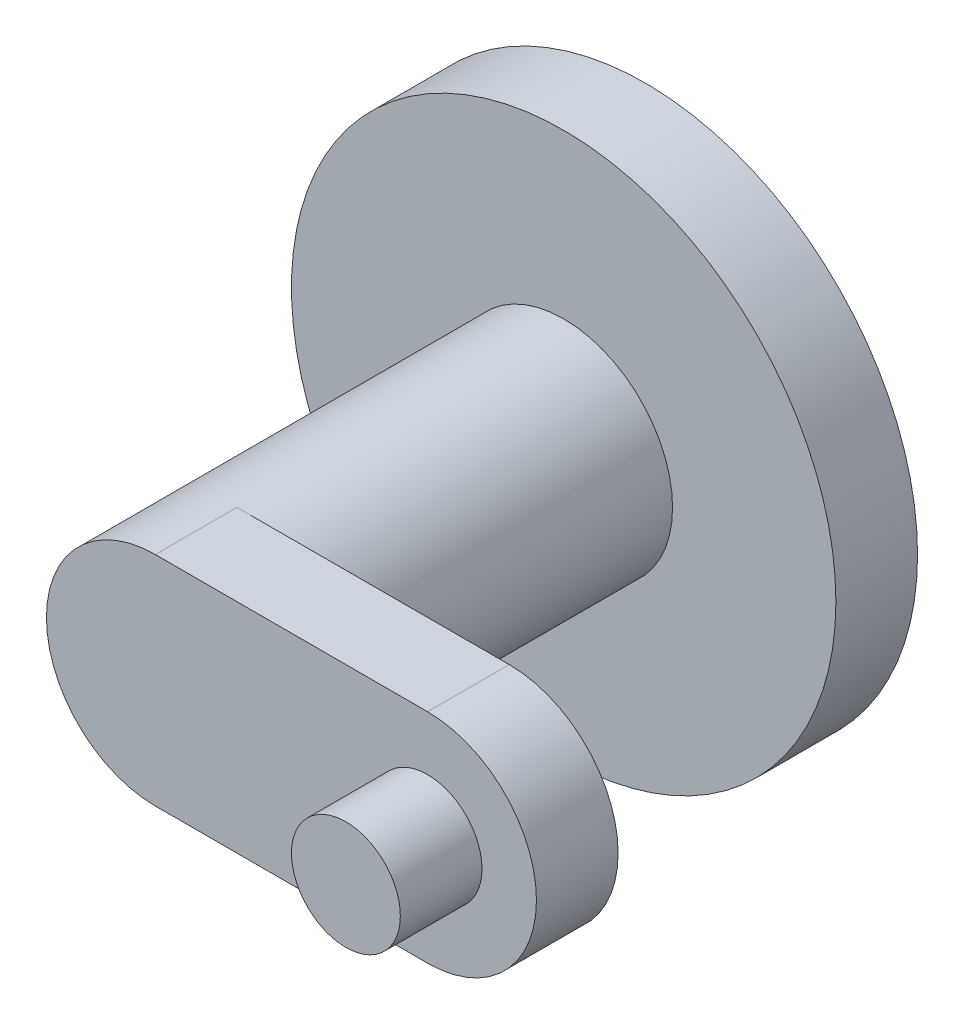
ISO-10303-21;
HEADER;
FILE_DESCRIPTION(('STEP AP214'),'2;1');
FILE_NAME('part.step','',(''),(''),'','','');
FILE_SCHEMA(('AUTOMOTIVE_DESIGN { 1 0 10303 214 1 1 1 1 }'));
ENDSEC;
DATA;
#1=APPLICATION_CONTEXT('core data for automotive mechanical design processes');
#2=APPLICATION_PROTOCOL_DEFINITION('international standard','automotive_design',2000,#1);
#3=PRODUCT_CONTEXT('',#1,'mechanical');
#4=PRODUCT('Part','Part','',(#3));
#5=PRODUCT_RELATED_PRODUCT_CATEGORY('part','',(#4));
#6=PRODUCT_DEFINITION_FORMATION('','',#4);
#7=PRODUCT_DEFINITION_CONTEXT('part definition',#1,'design');
#8=PRODUCT_DEFINITION('design','',#6,#7);
#9=PRODUCT_DEFINITION_SHAPE('','',#8);
#10=(LENGTH_UNIT() NAMED_UNIT(*) SI_UNIT(.MILLI.,.METRE.));
#11=(NAMED_UNIT(*) PLANE_ANGLE_UNIT() SI_UNIT($,.RADIAN.));
#12=(NAMED_UNIT(*) SI_UNIT($,.STERADIAN.) SOLID_ANGLE_UNIT());
#13=UNCERTAINTY_MEASURE_WITH_UNIT(LENGTH_MEASURE(1.E-05),#10,'distance_accuracy_value','');
#14=(GEOMETRIC_REPRESENTATION_CONTEXT(3) GLOBAL_UNCERTAINTY_ASSIGNED_CONTEXT((#13)) GLOBAL_UNIT_ASSIGNED_CONTEXT((#10,
#11,#12)) REPRESENTATION_CONTEXT('',''));
#15=CARTESIAN_POINT('',(0.,0.,0.));
#16=DIRECTION('',(0.,0.,1.));
#17=DIRECTION('',(1.,0.,0.));
#18=AXIS2_PLACEMENT_3D('',#15,#16,#17);
#19=CARTESIAN_POINT('',(0.,0.,30.));
#20=DIRECTION('',(0.,0.,-1.));
#21=DIRECTION('',(-1.,0.,0.));
#22=AXIS2_PLACEMENT_3D('',#19,#20,#21);
#23=CYLINDRICAL_SURFACE('',#22,100.);
#24=CARTESIAN_POINT('',(0.,0.,30.));
#25=DIRECTION('',(0.,0.,1.));
#26=DIRECTION('',(1.,0.,0.));
#27=AXIS2_PLACEMENT_3D('',#24,#25,#26);
#28=CIRCLE('',#27,100.);
#29=CARTESIAN_POINT('',(100.,0.,30.));
#30=VERTEX_POINT('',#29);
#31=EDGE_CURVE('E72',#30,#30,#28,.T.);
#32=ORIENTED_EDGE('',*,*,#31,.F.);
#33=EDGE_LOOP('',(#32));
#34=FACE_BOUND('',#33,.T.);
#35=CARTESIAN_POINT('',(0.,0.,0.));
#36=DIRECTION('',(0.,0.,1.));
#37=DIRECTION('',(1.,0.,0.));
#38=AXIS2_PLACEMENT_3D('',#35,#36,#37);
#39=CIRCLE('',#38,100.);
#40=CARTESIAN_POINT('',(100.,0.,0.));
#41=VERTEX_POINT('',#40);
#42=EDGE_CURVE('E67',#41,#41,#39,.T.);
#43=ORIENTED_EDGE('',*,*,#42,.T.);
#44=EDGE_LOOP('',(#43));
#45=FACE_BOUND('',#44,.T.);
#46=ADVANCED_FACE('F64',(#34,#45),#23,.T.);
#47=CARTESIAN_POINT('',(0.,0.,30.));
#48=DIRECTION('',(0.,0.,1.));
#49=DIRECTION('',(1.,0.,0.));
#50=AXIS2_PLACEMENT_3D('',#47,#48,#49);
#51=PLANE('',#50);
#52=CARTESIAN_POINT('',(0.,0.,30.));
#53=DIRECTION('',(0.,0.,1.));
#54=DIRECTION('',(1.,0.,0.));
#55=AXIS2_PLACEMENT_3D('',#52,#53,#54);
#56=CIRCLE('',#55,40.);
#57=CARTESIAN_POINT('',(40.,0.,30.));
#58=VERTEX_POINT('',#57);
#59=EDGE_CURVE('E12',#58,#58,#56,.T.);
#60=ORIENTED_EDGE('',*,*,#59,.F.);
#61=EDGE_LOOP('',(#60));
#62=FACE_BOUND('',#61,.T.);
#63=ORIENTED_EDGE('',*,*,#31,.T.);
#64=EDGE_LOOP('',(#63));
#65=FACE_BOUND('',#64,.T.);
#66=ADVANCED_FACE('F150',(#62,#65),#51,.T.);
#67=CARTESIAN_POINT('',(0.,0.,0.));
#68=DIRECTION('',(0.,0.,1.));
#69=DIRECTION('',(1.,0.,0.));
#70=AXIS2_PLACEMENT_3D('',#67,#68,#69);
#71=PLANE('',#70);
#72=ORIENTED_EDGE('',*,*,#42,.F.);
#73=EDGE_LOOP('',(#72));
#74=FACE_BOUND('',#73,.T.);
#75=ADVANCED_FACE('F147',(#74),#71,.F.);
#76=CARTESIAN_POINT('',(0.,0.,180.));
#77=DIRECTION('',(0.,0.,-1.));
#78=DIRECTION('',(-1.,0.,0.));
#79=AXIS2_PLACEMENT_3D('',#76,#77,#78);
#80=CYLINDRICAL_SURFACE('',#79,40.);
#81=CARTESIAN_POINT('',(0.,0.,180.));
#82=DIRECTION('',(0.,0.,1.));
#83=DIRECTION('',(1.,0.,0.));
#84=AXIS2_PLACEMENT_3D('',#81,#82,#83);
#85=CIRCLE('',#84,40.);
#86=CARTESIAN_POINT('',(0.,40.,180.));
#87=VERTEX_POINT('',#86);
#88=CARTESIAN_POINT('',(0.,-40.,180.));
#89=VERTEX_POINT('',#88);
#90=EDGE_CURVE('E80',#87,#89,#85,.T.);
#91=ORIENTED_EDGE('',*,*,#90,.F.);
#92=DIRECTION('',(0.,0.,1.));
#93=VECTOR('',#92,1.);
#94=CARTESIAN_POINT('',(0.,40.,150.));
#95=LINE('',#94,#93);
#96=CARTESIAN_POINT('',(0.,40.,150.));
#97=VERTEX_POINT('',#96);
#98=EDGE_CURVE('E130',#97,#87,#95,.T.);
#99=ORIENTED_EDGE('',*,*,#98,.F.);
#100=CARTESIAN_POINT('',(0.,0.,150.));
#101=DIRECTION('',(0.,0.,1.));
#102=DIRECTION('',(1.,0.,0.));
#103=AXIS2_PLACEMENT_3D('',#100,#101,#102);
#104=CIRCLE('',#103,40.);
#105=CARTESIAN_POINT('',(0.,-40.,150.));
#106=VERTEX_POINT('',#105);
#107=EDGE_CURVE('E85',#106,#97,#104,.T.);
#108=ORIENTED_EDGE('',*,*,#107,.F.);
#109=DIRECTION('',(0.,0.,1.));
#110=VECTOR('',#109,1.);
#111=CARTESIAN_POINT('',(0.,-40.,150.));
#112=LINE('',#111,#110);
#113=EDGE_CURVE('E135',#106,#89,#112,.T.);
#114=ORIENTED_EDGE('',*,*,#113,.T.);
#115=EDGE_LOOP('',(#91,#99,#108,#114));
#116=FACE_BOUND('',#115,.T.);
#117=ORIENTED_EDGE('',*,*,#59,.T.);
#118=EDGE_LOOP('',(#117));
#119=FACE_BOUND('',#118,.T.);
#120=ADVANCED_FACE('F149',(#116,#119),#80,.T.);
#121=CARTESIAN_POINT('',(0.,0.,180.));
#122=DIRECTION('',(0.,0.,1.));
#123=DIRECTION('',(1.,0.,0.));
#124=AXIS2_PLACEMENT_3D('',#121,#122,#123);
#125=PLANE('',#124);
#126=CARTESIAN_POINT('',(100.,0.,180.));
#127=DIRECTION('',(0.,0.,1.));
#128=DIRECTION('',(1.,0.,0.));
#129=AXIS2_PLACEMENT_3D('',#126,#127,#128);
#130=CIRCLE('',#129,20.);
#131=CARTESIAN_POINT('',(120.,0.,180.));
#132=VERTEX_POINT('',#131);
#133=EDGE_CURVE('E253',#132,#132,#130,.T.);
#134=ORIENTED_EDGE('',*,*,#133,.F.);
#135=EDGE_LOOP('',(#134));
#136=FACE_BOUND('',#135,.T.);
#137=ORIENTED_EDGE('',*,*,#90,.T.);
#138=DIRECTION('',(1.,0.,0.));
#139=VECTOR('',#138,1.);
#140=CARTESIAN_POINT('',(0.,-40.,180.));
#141=LINE('',#140,#139);
#142=CARTESIAN_POINT('',(100.,-40.,180.));
#143=VERTEX_POINT('',#142);
#144=EDGE_CURVE('E118',#89,#143,#141,.T.);
#145=ORIENTED_EDGE('',*,*,#144,.T.);
#146=CARTESIAN_POINT('',(100.,0.,180.));
#147=DIRECTION('',(0.,0.,1.));
#148=DIRECTION('',(1.,0.,0.));
#149=AXIS2_PLACEMENT_3D('',#146,#147,#148);
#150=CIRCLE('',#149,40.);
#151=CARTESIAN_POINT('',(100.,40.,180.));
#152=VERTEX_POINT('',#151);
#153=EDGE_CURVE('E105',#143,#152,#150,.T.);
#154=ORIENTED_EDGE('',*,*,#153,.T.);
#155=DIRECTION('',(1.,0.,0.));
#156=VECTOR('',#155,1.);
#157=CARTESIAN_POINT('',(0.,40.,180.));
#158=LINE('',#157,#156);
#159=EDGE_CURVE('E117',#87,#152,#158,.T.);
#160=ORIENTED_EDGE('',*,*,#159,.F.);
#161=EDGE_LOOP('',(#137,#145,#154,#160));
#162=FACE_BOUND('',#161,.T.);
#163=ADVANCED_FACE('F121',(#136,#162),#125,.T.);
#164=CARTESIAN_POINT('',(0.,0.,150.));
#165=DIRECTION('',(0.,0.,1.));
#166=DIRECTION('',(1.,0.,0.));
#167=AXIS2_PLACEMENT_3D('',#164,#165,#166);
#168=PLANE('',#167);
#169=DIRECTION('',(1.,0.,0.));
#170=VECTOR('',#169,1.);
#171=CARTESIAN_POINT('',(0.,-40.,150.));
#172=LINE('',#171,#170);
#173=CARTESIAN_POINT('',(100.,-40.,150.));
#174=VERTEX_POINT('',#173);
#175=EDGE_CURVE('E128',#106,#174,#172,.T.);
#176=ORIENTED_EDGE('',*,*,#175,.F.);
#177=ORIENTED_EDGE('',*,*,#107,.T.);
#178=DIRECTION('',(1.,0.,0.));
#179=VECTOR('',#178,1.);
#180=CARTESIAN_POINT('',(0.,40.,150.));
#181=LINE('',#180,#179);
#182=CARTESIAN_POINT('',(100.,40.,150.));
#183=VERTEX_POINT('',#182);
#184=EDGE_CURVE('E124',#97,#183,#181,.T.);
#185=ORIENTED_EDGE('',*,*,#184,.T.);
#186=CARTESIAN_POINT('',(100.,0.,150.));
#187=DIRECTION('',(0.,0.,1.));
#188=DIRECTION('',(1.,0.,0.));
#189=AXIS2_PLACEMENT_3D('',#186,#187,#188);
#190=CIRCLE('',#189,40.);
#191=EDGE_CURVE('E255',#174,#183,#190,.T.);
#192=ORIENTED_EDGE('',*,*,#191,.F.);
#193=EDGE_LOOP('',(#176,#177,#185,#192));
#194=FACE_BOUND('',#193,.T.);
#195=ADVANCED_FACE('F181',(#194),#168,.F.);
#196=CARTESIAN_POINT('',(0.,40.,180.));
#197=DIRECTION('',(0.,1.,0.));
#198=DIRECTION('',(0.,0.,1.));
#199=AXIS2_PLACEMENT_3D('',#196,#197,#198);
#200=PLANE('',#199);
#201=ORIENTED_EDGE('',*,*,#184,.F.);
#202=ORIENTED_EDGE('',*,*,#98,.T.);
#203=ORIENTED_EDGE('',*,*,#159,.T.);
#204=DIRECTION('',(0.,0.,-1.));
#205=VECTOR('',#204,1.);
#206=CARTESIAN_POINT('',(100.,40.,180.));
#207=LINE('',#206,#205);
#208=EDGE_CURVE('E112',#152,#183,#207,.T.);
#209=ORIENTED_EDGE('',*,*,#208,.T.);
#210=EDGE_LOOP('',(#201,#202,#203,#209));
#211=FACE_BOUND('',#210,.T.);
#212=ADVANCED_FACE('F186',(#211),#200,.T.);
#213=CARTESIAN_POINT('',(100.,0.,180.));
#214=DIRECTION('',(0.,0.,-1.));
#215=DIRECTION('',(-1.,0.,0.));
#216=AXIS2_PLACEMENT_3D('',#213,#214,#215);
#217=CYLINDRICAL_SURFACE('',#216,40.);
#218=ORIENTED_EDGE('',*,*,#191,.T.);
#219=ORIENTED_EDGE('',*,*,#208,.F.);
#220=ORIENTED_EDGE('',*,*,#153,.F.);
#221=DIRECTION('',(0.,0.,-1.));
#222=VECTOR('',#221,1.);
#223=CARTESIAN_POINT('',(100.,-40.,180.));
#224=LINE('',#223,#222);
#225=EDGE_CURVE('E110',#143,#174,#224,.T.);
#226=ORIENTED_EDGE('',*,*,#225,.T.);
#227=EDGE_LOOP('',(#218,#219,#220,#226));
#228=FACE_BOUND('',#227,.T.);
#229=ADVANCED_FACE('F108',(#228),#217,.T.);
#230=CARTESIAN_POINT('',(0.,-40.,180.));
#231=DIRECTION('',(0.,1.,0.));
#232=DIRECTION('',(0.,0.,1.));
#233=AXIS2_PLACEMENT_3D('',#230,#231,#232);
#234=PLANE('',#233);
#235=ORIENTED_EDGE('',*,*,#175,.T.);
#236=ORIENTED_EDGE('',*,*,#225,.F.);
#237=ORIENTED_EDGE('',*,*,#144,.F.);
#238=ORIENTED_EDGE('',*,*,#113,.F.);
#239=EDGE_LOOP('',(#235,#236,#237,#238));
#240=FACE_BOUND('',#239,.T.);
#241=ADVANCED_FACE('F126',(#240),#234,.F.);
#242=CARTESIAN_POINT('',(100.,0.,210.));
#243=DIRECTION('',(0.,0.,-1.));
#244=DIRECTION('',(-1.,0.,0.));
#245=AXIS2_PLACEMENT_3D('',#242,#243,#244);
#246=CYLINDRICAL_SURFACE('',#245,20.);
#247=CARTESIAN_POINT('',(100.,0.,210.));
#248=DIRECTION('',(0.,0.,1.));
#249=DIRECTION('',(1.,0.,0.));
#250=AXIS2_PLACEMENT_3D('',#247,#248,#249);
#251=CIRCLE('',#250,20.);
#252=CARTESIAN_POINT('',(120.,0.,210.));
#253=VERTEX_POINT('',#252);
#254=EDGE_CURVE('E252',#253,#253,#251,.T.);
#255=ORIENTED_EDGE('',*,*,#254,.F.);
#256=EDGE_LOOP('',(#255));
#257=FACE_BOUND('',#256,.T.);
#258=ORIENTED_EDGE('',*,*,#133,.T.);
#259=EDGE_LOOP('',(#258));
#260=FACE_BOUND('',#259,.T.);
#261=ADVANCED_FACE('F217',(#257,#260),#246,.T.);
#262=CARTESIAN_POINT('',(100.,0.,210.));
#263=DIRECTION('',(0.,0.,1.));
#264=DIRECTION('',(1.,0.,0.));
#265=AXIS2_PLACEMENT_3D('',#262,#263,#264);
#266=PLANE('',#265);
#267=ORIENTED_EDGE('',*,*,#254,.T.);
#268=EDGE_LOOP('',(#267));
#269=FACE_BOUND('',#268,.T.);
#270=ADVANCED_FACE('F236',(#269),#266,.T.);
#271=CLOSED_SHELL('',(#46,#66,#75,#120,#163,#195,#212,#229,#241,#261,#270));
#272=MANIFOLD_SOLID_BREP('B2',#271);
#273=ADVANCED_BREP_SHAPE_REPRESENTATION('',(#18,#272),#14);
#274=SHAPE_DEFINITION_REPRESENTATION(#9,#273);
ENDSEC;
END-ISO-10303-21;
